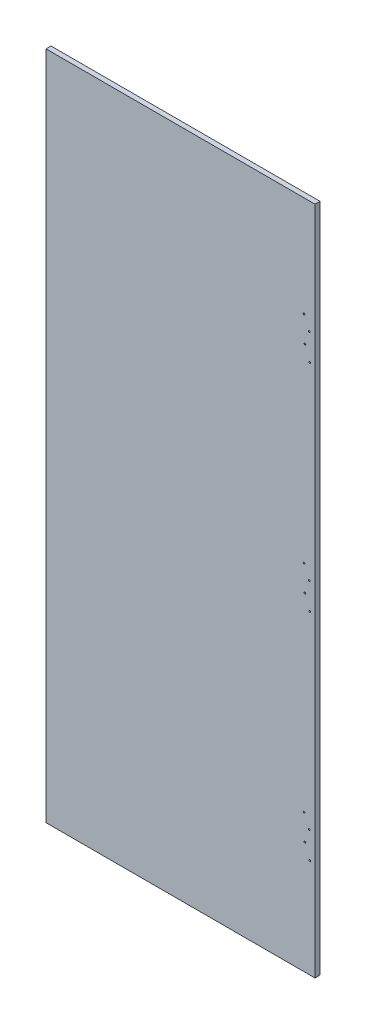
ISO-10303-21;
HEADER;
FILE_DESCRIPTION(('STEP AP214'),'2;1');
FILE_NAME('part.step','',(''),(''),'','','');
FILE_SCHEMA(('AUTOMOTIVE_DESIGN { 1 0 10303 214 1 1 1 1 }'));
ENDSEC;
DATA;
#1=APPLICATION_CONTEXT('core data for automotive mechanical design processes');
#2=APPLICATION_PROTOCOL_DEFINITION('international standard','automotive_design',2000,#1);
#3=PRODUCT_CONTEXT('',#1,'mechanical');
#4=PRODUCT('Part','Part','',(#3));
#5=PRODUCT_RELATED_PRODUCT_CATEGORY('part','',(#4));
#6=PRODUCT_DEFINITION_FORMATION('','',#4);
#7=PRODUCT_DEFINITION_CONTEXT('part definition',#1,'design');
#8=PRODUCT_DEFINITION('design','',#6,#7);
#9=PRODUCT_DEFINITION_SHAPE('','',#8);
#10=(LENGTH_UNIT() NAMED_UNIT(*) SI_UNIT(.MILLI.,.METRE.));
#11=(NAMED_UNIT(*) PLANE_ANGLE_UNIT() SI_UNIT($,.RADIAN.));
#12=(NAMED_UNIT(*) SI_UNIT($,.STERADIAN.) SOLID_ANGLE_UNIT());
#13=UNCERTAINTY_MEASURE_WITH_UNIT(LENGTH_MEASURE(1.E-05),#10,'distance_accuracy_value','');
#14=(GEOMETRIC_REPRESENTATION_CONTEXT(3) GLOBAL_UNCERTAINTY_ASSIGNED_CONTEXT((#13)) GLOBAL_UNIT_ASSIGNED_CONTEXT((#10,
#11,#12)) REPRESENTATION_CONTEXT('',''));
#15=CARTESIAN_POINT('',(0.,0.,0.));
#16=DIRECTION('',(0.,0.,1.));
#17=DIRECTION('',(1.,0.,0.));
#18=AXIS2_PLACEMENT_3D('',#15,#16,#17);
#19=CARTESIAN_POINT('',(111.476778690033,291.039647903282,-15.));
#20=DIRECTION('',(1.,0.,0.));
#21=DIRECTION('',(0.,1.,0.));
#22=AXIS2_PLACEMENT_3D('',#19,#20,#21);
#23=PLANE('',#22);
#24=DIRECTION('',(0.,1.,0.));
#25=VECTOR('',#24,1.);
#26=CARTESIAN_POINT('',(111.476778690033,291.039647903282,0.));
#27=LINE('',#26,#25);
#28=CARTESIAN_POINT('',(111.476778690033,-1728.77325270254,0.));
#29=VERTEX_POINT('',#28);
#30=CARTESIAN_POINT('',(111.476778690033,291.039647903282,0.));
#31=VERTEX_POINT('',#30);
#32=EDGE_CURVE('E101',#29,#31,#27,.T.);
#33=ORIENTED_EDGE('',*,*,#32,.F.);
#34=DIRECTION('',(0.,0.,1.));
#35=VECTOR('',#34,1.);
#36=CARTESIAN_POINT('',(111.476778690033,-1728.77325270254,-15.));
#37=LINE('',#36,#35);
#38=CARTESIAN_POINT('',(111.476778690033,-1728.77325270254,-15.));
#39=VERTEX_POINT('',#38);
#40=EDGE_CURVE('E11',#39,#29,#37,.T.);
#41=ORIENTED_EDGE('',*,*,#40,.F.);
#42=DIRECTION('',(0.,1.,0.));
#43=VECTOR('',#42,1.);
#44=CARTESIAN_POINT('',(111.476778690033,291.039647903282,-15.));
#45=LINE('',#44,#43);
#46=CARTESIAN_POINT('',(111.476778690033,291.039647903282,-15.));
#47=VERTEX_POINT('',#46);
#48=EDGE_CURVE('E94',#39,#47,#45,.T.);
#49=ORIENTED_EDGE('',*,*,#48,.T.);
#50=DIRECTION('',(0.,0.,1.));
#51=VECTOR('',#50,1.);
#52=CARTESIAN_POINT('',(111.476778690033,291.039647903282,-15.));
#53=LINE('',#52,#51);
#54=EDGE_CURVE('E39',#47,#31,#53,.T.);
#55=ORIENTED_EDGE('',*,*,#54,.T.);
#56=EDGE_LOOP('',(#33,#41,#49,#55));
#57=FACE_BOUND('',#56,.T.);
#58=ADVANCED_FACE('F36',(#57),#23,.T.);
#59=CARTESIAN_POINT('',(111.476778690033,-1728.77325270254,-15.));
#60=DIRECTION('',(0.,-1.,0.));
#61=DIRECTION('',(0.,0.,-1.));
#62=AXIS2_PLACEMENT_3D('',#59,#60,#61);
#63=PLANE('',#62);
#64=DIRECTION('',(1.,0.,0.));
#65=VECTOR('',#64,1.);
#66=CARTESIAN_POINT('',(111.476778690033,-1728.77325270254,0.));
#67=LINE('',#66,#65);
#68=CARTESIAN_POINT('',(-699.083744936651,-1728.77325270254,0.));
#69=VERTEX_POINT('',#68);
#70=EDGE_CURVE('E96',#69,#29,#67,.T.);
#71=ORIENTED_EDGE('',*,*,#70,.F.);
#72=DIRECTION('',(0.,0.,1.));
#73=VECTOR('',#72,1.);
#74=CARTESIAN_POINT('',(-699.083744936651,-1728.77325270254,-15.));
#75=LINE('',#74,#73);
#76=CARTESIAN_POINT('',(-699.083744936651,-1728.77325270254,-15.));
#77=VERTEX_POINT('',#76);
#78=EDGE_CURVE('E45',#77,#69,#75,.T.);
#79=ORIENTED_EDGE('',*,*,#78,.F.);
#80=DIRECTION('',(1.,0.,0.));
#81=VECTOR('',#80,1.);
#82=CARTESIAN_POINT('',(111.476778690033,-1728.77325270254,-15.));
#83=LINE('',#82,#81);
#84=EDGE_CURVE('E91',#77,#39,#83,.T.);
#85=ORIENTED_EDGE('',*,*,#84,.T.);
#86=ORIENTED_EDGE('',*,*,#40,.T.);
#87=EDGE_LOOP('',(#71,#79,#85,#86));
#88=FACE_BOUND('',#87,.T.);
#89=ADVANCED_FACE('F112',(#88),#63,.T.);
#90=CARTESIAN_POINT('',(-699.083744936651,291.039647903282,-15.));
#91=DIRECTION('',(-1.,0.,0.));
#92=DIRECTION('',(0.,0.,1.));
#93=AXIS2_PLACEMENT_3D('',#90,#91,#92);
#94=PLANE('',#93);
#95=DIRECTION('',(0.,-1.,0.));
#96=VECTOR('',#95,1.);
#97=CARTESIAN_POINT('',(-699.083744936651,291.039647903282,0.));
#98=LINE('',#97,#96);
#99=CARTESIAN_POINT('',(-699.083744936651,291.039647903282,0.));
#100=VERTEX_POINT('',#99);
#101=EDGE_CURVE('E86',#100,#69,#98,.T.);
#102=ORIENTED_EDGE('',*,*,#101,.F.);
#103=DIRECTION('',(0.,0.,1.));
#104=VECTOR('',#103,1.);
#105=CARTESIAN_POINT('',(-699.083744936651,291.039647903282,-15.));
#106=LINE('',#105,#104);
#107=CARTESIAN_POINT('',(-699.083744936651,291.039647903282,-15.));
#108=VERTEX_POINT('',#107);
#109=EDGE_CURVE('E81',#108,#100,#106,.T.);
#110=ORIENTED_EDGE('',*,*,#109,.F.);
#111=DIRECTION('',(0.,-1.,0.));
#112=VECTOR('',#111,1.);
#113=CARTESIAN_POINT('',(-699.083744936651,291.039647903282,-15.));
#114=LINE('',#113,#112);
#115=EDGE_CURVE('E84',#108,#77,#114,.T.);
#116=ORIENTED_EDGE('',*,*,#115,.T.);
#117=ORIENTED_EDGE('',*,*,#78,.T.);
#118=EDGE_LOOP('',(#102,#110,#116,#117));
#119=FACE_BOUND('',#118,.T.);
#120=ADVANCED_FACE('F83',(#119),#94,.T.);
#121=CARTESIAN_POINT('',(111.476778690033,291.039647903282,-15.));
#122=DIRECTION('',(0.,1.,0.));
#123=DIRECTION('',(-1.,0.,0.));
#124=AXIS2_PLACEMENT_3D('',#121,#122,#123);
#125=PLANE('',#124);
#126=DIRECTION('',(-1.,0.,0.));
#127=VECTOR('',#126,1.);
#128=CARTESIAN_POINT('',(111.476778690033,291.039647903282,0.));
#129=LINE('',#128,#127);
#130=EDGE_CURVE('E104',#31,#100,#129,.T.);
#131=ORIENTED_EDGE('',*,*,#130,.F.);
#132=ORIENTED_EDGE('',*,*,#54,.F.);
#133=DIRECTION('',(-1.,0.,0.));
#134=VECTOR('',#133,1.);
#135=CARTESIAN_POINT('',(111.476778690033,291.039647903282,-15.));
#136=LINE('',#135,#134);
#137=EDGE_CURVE('E90',#47,#108,#136,.T.);
#138=ORIENTED_EDGE('',*,*,#137,.T.);
#139=ORIENTED_EDGE('',*,*,#109,.T.);
#140=EDGE_LOOP('',(#131,#132,#138,#139));
#141=FACE_BOUND('',#140,.T.);
#142=ADVANCED_FACE('F93',(#141),#125,.T.);
#143=CARTESIAN_POINT('',(0.,0.,-15.));
#144=DIRECTION('',(0.,0.,-1.));
#145=DIRECTION('',(-1.,0.,0.));
#146=AXIS2_PLACEMENT_3D('',#143,#144,#145);
#147=PLANE('',#146);
#148=CARTESIAN_POINT('',(78.5158759424546,-12.2840764917066,-15.));
#149=DIRECTION('',(0.,0.,1.));
#150=DIRECTION('',(1.,0.,0.));
#151=AXIS2_PLACEMENT_3D('',#148,#149,#150);
#152=CIRCLE('',#151,2.6406386398121);
#153=CARTESIAN_POINT('',(81.1565145822667,-12.2840764917066,-15.));
#154=VERTEX_POINT('',#153);
#155=EDGE_CURVE('E105',#154,#154,#152,.T.);
#156=ORIENTED_EDGE('',*,*,#155,.T.);
#157=EDGE_LOOP('',(#156));
#158=FACE_BOUND('',#157,.T.);
#159=CARTESIAN_POINT('',(94.1631537007583,-49.8170727082532,-15.));
#160=DIRECTION('',(0.,0.,1.));
#161=DIRECTION('',(1.,0.,0.));
#162=AXIS2_PLACEMENT_3D('',#159,#160,#161);
#163=CIRCLE('',#162,2.50520693818279);
#164=CARTESIAN_POINT('',(96.6683606389411,-49.8170727082532,-15.));
#165=VERTEX_POINT('',#164);
#166=EDGE_CURVE('E188',#165,#165,#163,.T.);
#167=ORIENTED_EDGE('',*,*,#166,.T.);
#168=EDGE_LOOP('',(#167));
#169=FACE_BOUND('',#168,.T.);
#170=CARTESIAN_POINT('',(81.1982664153066,-89.2847594514257,-15.));
#171=DIRECTION('',(0.,0.,1.));
#172=DIRECTION('',(1.,0.,0.));
#173=AXIS2_PLACEMENT_3D('',#170,#171,#172);
#174=CIRCLE('',#173,2.55269895239916);
#175=CARTESIAN_POINT('',(83.7509653677058,-89.2847594514257,-15.));
#176=VERTEX_POINT('',#175);
#177=EDGE_CURVE('E197',#176,#176,#174,.T.);
#178=ORIENTED_EDGE('',*,*,#177,.T.);
#179=EDGE_LOOP('',(#178));
#180=FACE_BOUND('',#179,.T.);
#181=CARTESIAN_POINT('',(95.951414015993,-130.300198615899,-15.));
#182=DIRECTION('',(0.,0.,1.));
#183=DIRECTION('',(1.,0.,0.));
#184=AXIS2_PLACEMENT_3D('',#181,#182,#183);
#185=CIRCLE('',#184,2.552695734833);
#186=CARTESIAN_POINT('',(98.504109750826,-130.300198615899,-15.));
#187=VERTEX_POINT('',#186);
#188=EDGE_CURVE('E203',#187,#187,#185,.T.);
#189=ORIENTED_EDGE('',*,*,#188,.T.);
#190=EDGE_LOOP('',(#189));
#191=FACE_BOUND('',#190,.T.);
#192=CARTESIAN_POINT('',(78.5158759424546,-662.284076491707,-15.));
#193=DIRECTION('',(0.,0.,1.));
#194=DIRECTION('',(1.,0.,0.));
#195=AXIS2_PLACEMENT_3D('',#192,#193,#194);
#196=CIRCLE('',#195,2.5526989933296);
#197=CARTESIAN_POINT('',(81.0685749357842,-662.284076491707,-15.));
#198=VERTEX_POINT('',#197);
#199=EDGE_CURVE('E209',#198,#198,#196,.T.);
#200=ORIENTED_EDGE('',*,*,#199,.T.);
#201=EDGE_LOOP('',(#200));
#202=FACE_BOUND('',#201,.T.);
#203=CARTESIAN_POINT('',(94.1631537007583,-699.817072708253,-15.));
#204=DIRECTION('',(0.,0.,1.));
#205=DIRECTION('',(1.,0.,0.));
#206=AXIS2_PLACEMENT_3D('',#203,#204,#205);
#207=CIRCLE('',#206,2.55269999999998);
#208=CARTESIAN_POINT('',(96.7158537007583,-699.817072708253,-15.));
#209=VERTEX_POINT('',#208);
#210=EDGE_CURVE('E215',#209,#209,#207,.T.);
#211=ORIENTED_EDGE('',*,*,#210,.T.);
#212=EDGE_LOOP('',(#211));
#213=FACE_BOUND('',#212,.T.);
#214=CARTESIAN_POINT('',(81.1982664153066,-739.284759451426,-15.));
#215=DIRECTION('',(0.,0.,1.));
#216=DIRECTION('',(1.,0.,0.));
#217=AXIS2_PLACEMENT_3D('',#214,#215,#216);
#218=CIRCLE('',#217,2.55258606888236);
#219=CARTESIAN_POINT('',(83.750852484189,-739.284759451426,-15.));
#220=VERTEX_POINT('',#219);
#221=EDGE_CURVE('E221',#220,#220,#218,.T.);
#222=ORIENTED_EDGE('',*,*,#221,.T.);
#223=EDGE_LOOP('',(#222));
#224=FACE_BOUND('',#223,.T.);
#225=CARTESIAN_POINT('',(95.951414015993,-780.300198615899,-15.));
#226=DIRECTION('',(0.,0.,1.));
#227=DIRECTION('',(1.,0.,0.));
#228=AXIS2_PLACEMENT_3D('',#225,#226,#227);
#229=CIRCLE('',#228,2.55258606888223);
#230=CARTESIAN_POINT('',(98.5040000848753,-780.300198615899,-15.));
#231=VERTEX_POINT('',#230);
#232=EDGE_CURVE('E227',#231,#231,#229,.T.);
#233=ORIENTED_EDGE('',*,*,#232,.T.);
#234=EDGE_LOOP('',(#233));
#235=FACE_BOUND('',#234,.T.);
#236=CARTESIAN_POINT('',(78.5158759424546,-1312.28407649171,-15.));
#237=DIRECTION('',(0.,0.,1.));
#238=DIRECTION('',(1.,0.,0.));
#239=AXIS2_PLACEMENT_3D('',#236,#237,#238);
#240=CIRCLE('',#239,2.55269191321423);
#241=CARTESIAN_POINT('',(81.0685678556688,-1312.28407649171,-15.));
#242=VERTEX_POINT('',#241);
#243=EDGE_CURVE('E233',#242,#242,#240,.T.);
#244=ORIENTED_EDGE('',*,*,#243,.T.);
#245=EDGE_LOOP('',(#244));
#246=FACE_BOUND('',#245,.T.);
#247=CARTESIAN_POINT('',(94.1631537007583,-1349.81707270825,-15.));
#248=DIRECTION('',(0.,0.,1.));
#249=DIRECTION('',(1.,0.,0.));
#250=AXIS2_PLACEMENT_3D('',#247,#248,#249);
#251=CIRCLE('',#250,2.55258606888224);
#252=CARTESIAN_POINT('',(96.7157397696405,-1349.81707270825,-15.));
#253=VERTEX_POINT('',#252);
#254=EDGE_CURVE('E239',#253,#253,#251,.T.);
#255=ORIENTED_EDGE('',*,*,#254,.T.);
#256=EDGE_LOOP('',(#255));
#257=FACE_BOUND('',#256,.T.);
#258=CARTESIAN_POINT('',(81.1982664153066,-1389.28475945143,-15.));
#259=DIRECTION('',(0.,0.,1.));
#260=DIRECTION('',(1.,0.,0.));
#261=AXIS2_PLACEMENT_3D('',#258,#259,#260);
#262=CIRCLE('',#261,2.55270000000007);
#263=CARTESIAN_POINT('',(83.7509664153067,-1389.28475945143,-15.));
#264=VERTEX_POINT('',#263);
#265=EDGE_CURVE('E245',#264,#264,#262,.T.);
#266=ORIENTED_EDGE('',*,*,#265,.T.);
#267=EDGE_LOOP('',(#266));
#268=FACE_BOUND('',#267,.T.);
#269=CARTESIAN_POINT('',(95.951414015993,-1430.3001986159,-15.));
#270=DIRECTION('',(0.,0.,1.));
#271=DIRECTION('',(1.,0.,0.));
#272=AXIS2_PLACEMENT_3D('',#269,#270,#271);
#273=CIRCLE('',#272,2.55270000000007);
#274=CARTESIAN_POINT('',(98.5041140159931,-1430.3001986159,-15.));
#275=VERTEX_POINT('',#274);
#276=EDGE_CURVE('E251',#275,#275,#273,.T.);
#277=ORIENTED_EDGE('',*,*,#276,.T.);
#278=EDGE_LOOP('',(#277));
#279=FACE_BOUND('',#278,.T.);
#280=ORIENTED_EDGE('',*,*,#48,.F.);
#281=ORIENTED_EDGE('',*,*,#84,.F.);
#282=ORIENTED_EDGE('',*,*,#115,.F.);
#283=ORIENTED_EDGE('',*,*,#137,.F.);
#284=EDGE_LOOP('',(#280,#281,#282,#283));
#285=FACE_BOUND('',#284,.T.);
#286=ADVANCED_FACE('F89',(#158,#169,#180,#191,#202,#213,#224,#235,#246,#257,#268,#279,#285),
#147,.T.);
#287=CARTESIAN_POINT('',(0.,0.,0.));
#288=DIRECTION('',(0.,0.,-1.));
#289=DIRECTION('',(-1.,0.,0.));
#290=AXIS2_PLACEMENT_3D('',#287,#288,#289);
#291=PLANE('',#290);
#292=CARTESIAN_POINT('',(78.5158759424546,-12.2840764917066,0.));
#293=DIRECTION('',(0.,0.,1.));
#294=DIRECTION('',(1.,0.,0.));
#295=AXIS2_PLACEMENT_3D('',#292,#293,#294);
#296=CIRCLE('',#295,2.6406386398121);
#297=CARTESIAN_POINT('',(81.1565145822667,-12.2840764917066,0.));
#298=VERTEX_POINT('',#297);
#299=EDGE_CURVE('E187',#298,#298,#296,.T.);
#300=ORIENTED_EDGE('',*,*,#299,.F.);
#301=EDGE_LOOP('',(#300));
#302=FACE_BOUND('',#301,.T.);
#303=CARTESIAN_POINT('',(94.1631537007583,-49.8170727082532,0.));
#304=DIRECTION('',(0.,0.,1.));
#305=DIRECTION('',(1.,0.,0.));
#306=AXIS2_PLACEMENT_3D('',#303,#304,#305);
#307=CIRCLE('',#306,2.50520693818279);
#308=CARTESIAN_POINT('',(96.6683606389411,-49.8170727082532,0.));
#309=VERTEX_POINT('',#308);
#310=EDGE_CURVE('E192',#309,#309,#307,.T.);
#311=ORIENTED_EDGE('',*,*,#310,.F.);
#312=EDGE_LOOP('',(#311));
#313=FACE_BOUND('',#312,.T.);
#314=CARTESIAN_POINT('',(81.1982664153066,-89.2847594514257,0.));
#315=DIRECTION('',(0.,0.,1.));
#316=DIRECTION('',(1.,0.,0.));
#317=AXIS2_PLACEMENT_3D('',#314,#315,#316);
#318=CIRCLE('',#317,2.55269895239916);
#319=CARTESIAN_POINT('',(83.7509653677058,-89.2847594514257,0.));
#320=VERTEX_POINT('',#319);
#321=EDGE_CURVE('E200',#320,#320,#318,.T.);
#322=ORIENTED_EDGE('',*,*,#321,.F.);
#323=EDGE_LOOP('',(#322));
#324=FACE_BOUND('',#323,.T.);
#325=CARTESIAN_POINT('',(95.951414015993,-130.300198615899,0.));
#326=DIRECTION('',(0.,0.,1.));
#327=DIRECTION('',(1.,0.,0.));
#328=AXIS2_PLACEMENT_3D('',#325,#326,#327);
#329=CIRCLE('',#328,2.552695734833);
#330=CARTESIAN_POINT('',(98.504109750826,-130.300198615899,0.));
#331=VERTEX_POINT('',#330);
#332=EDGE_CURVE('E206',#331,#331,#329,.T.);
#333=ORIENTED_EDGE('',*,*,#332,.F.);
#334=EDGE_LOOP('',(#333));
#335=FACE_BOUND('',#334,.T.);
#336=CARTESIAN_POINT('',(78.5158759424546,-662.284076491707,0.));
#337=DIRECTION('',(0.,0.,1.));
#338=DIRECTION('',(1.,0.,0.));
#339=AXIS2_PLACEMENT_3D('',#336,#337,#338);
#340=CIRCLE('',#339,2.5526989933296);
#341=CARTESIAN_POINT('',(81.0685749357842,-662.284076491707,0.));
#342=VERTEX_POINT('',#341);
#343=EDGE_CURVE('E212',#342,#342,#340,.T.);
#344=ORIENTED_EDGE('',*,*,#343,.F.);
#345=EDGE_LOOP('',(#344));
#346=FACE_BOUND('',#345,.T.);
#347=CARTESIAN_POINT('',(94.1631537007583,-699.817072708253,0.));
#348=DIRECTION('',(0.,0.,1.));
#349=DIRECTION('',(1.,0.,0.));
#350=AXIS2_PLACEMENT_3D('',#347,#348,#349);
#351=CIRCLE('',#350,2.55269999999998);
#352=CARTESIAN_POINT('',(96.7158537007583,-699.817072708253,0.));
#353=VERTEX_POINT('',#352);
#354=EDGE_CURVE('E218',#353,#353,#351,.T.);
#355=ORIENTED_EDGE('',*,*,#354,.F.);
#356=EDGE_LOOP('',(#355));
#357=FACE_BOUND('',#356,.T.);
#358=CARTESIAN_POINT('',(81.1982664153066,-739.284759451426,0.));
#359=DIRECTION('',(0.,0.,1.));
#360=DIRECTION('',(1.,0.,0.));
#361=AXIS2_PLACEMENT_3D('',#358,#359,#360);
#362=CIRCLE('',#361,2.55258606888236);
#363=CARTESIAN_POINT('',(83.750852484189,-739.284759451426,0.));
#364=VERTEX_POINT('',#363);
#365=EDGE_CURVE('E224',#364,#364,#362,.T.);
#366=ORIENTED_EDGE('',*,*,#365,.F.);
#367=EDGE_LOOP('',(#366));
#368=FACE_BOUND('',#367,.T.);
#369=CARTESIAN_POINT('',(95.951414015993,-780.300198615899,0.));
#370=DIRECTION('',(0.,0.,1.));
#371=DIRECTION('',(1.,0.,0.));
#372=AXIS2_PLACEMENT_3D('',#369,#370,#371);
#373=CIRCLE('',#372,2.55258606888223);
#374=CARTESIAN_POINT('',(98.5040000848753,-780.300198615899,0.));
#375=VERTEX_POINT('',#374);
#376=EDGE_CURVE('E230',#375,#375,#373,.T.);
#377=ORIENTED_EDGE('',*,*,#376,.F.);
#378=EDGE_LOOP('',(#377));
#379=FACE_BOUND('',#378,.T.);
#380=CARTESIAN_POINT('',(78.5158759424546,-1312.28407649171,0.));
#381=DIRECTION('',(0.,0.,1.));
#382=DIRECTION('',(1.,0.,0.));
#383=AXIS2_PLACEMENT_3D('',#380,#381,#382);
#384=CIRCLE('',#383,2.55269191321423);
#385=CARTESIAN_POINT('',(81.0685678556688,-1312.28407649171,0.));
#386=VERTEX_POINT('',#385);
#387=EDGE_CURVE('E236',#386,#386,#384,.T.);
#388=ORIENTED_EDGE('',*,*,#387,.F.);
#389=EDGE_LOOP('',(#388));
#390=FACE_BOUND('',#389,.T.);
#391=CARTESIAN_POINT('',(94.1631537007583,-1349.81707270825,0.));
#392=DIRECTION('',(0.,0.,1.));
#393=DIRECTION('',(1.,0.,0.));
#394=AXIS2_PLACEMENT_3D('',#391,#392,#393);
#395=CIRCLE('',#394,2.55258606888224);
#396=CARTESIAN_POINT('',(96.7157397696405,-1349.81707270825,0.));
#397=VERTEX_POINT('',#396);
#398=EDGE_CURVE('E242',#397,#397,#395,.T.);
#399=ORIENTED_EDGE('',*,*,#398,.F.);
#400=EDGE_LOOP('',(#399));
#401=FACE_BOUND('',#400,.T.);
#402=CARTESIAN_POINT('',(81.1982664153066,-1389.28475945143,0.));
#403=DIRECTION('',(0.,0.,1.));
#404=DIRECTION('',(1.,0.,0.));
#405=AXIS2_PLACEMENT_3D('',#402,#403,#404);
#406=CIRCLE('',#405,2.55270000000007);
#407=CARTESIAN_POINT('',(83.7509664153067,-1389.28475945143,0.));
#408=VERTEX_POINT('',#407);
#409=EDGE_CURVE('E248',#408,#408,#406,.T.);
#410=ORIENTED_EDGE('',*,*,#409,.F.);
#411=EDGE_LOOP('',(#410));
#412=FACE_BOUND('',#411,.T.);
#413=CARTESIAN_POINT('',(95.951414015993,-1430.3001986159,0.));
#414=DIRECTION('',(0.,0.,1.));
#415=DIRECTION('',(1.,0.,0.));
#416=AXIS2_PLACEMENT_3D('',#413,#414,#415);
#417=CIRCLE('',#416,2.55270000000007);
#418=CARTESIAN_POINT('',(98.5041140159931,-1430.3001986159,0.));
#419=VERTEX_POINT('',#418);
#420=EDGE_CURVE('E253',#419,#419,#417,.T.);
#421=ORIENTED_EDGE('',*,*,#420,.F.);
#422=EDGE_LOOP('',(#421));
#423=FACE_BOUND('',#422,.T.);
#424=ORIENTED_EDGE('',*,*,#32,.T.);
#425=ORIENTED_EDGE('',*,*,#130,.T.);
#426=ORIENTED_EDGE('',*,*,#101,.T.);
#427=ORIENTED_EDGE('',*,*,#70,.T.);
#428=EDGE_LOOP('',(#424,#425,#426,#427));
#429=FACE_BOUND('',#428,.T.);
#430=ADVANCED_FACE('F111',(#302,#313,#324,#335,#346,#357,#368,#379,#390,#401,#412,#423,#429),
#291,.F.);
#431=CARTESIAN_POINT('',(95.951414015993,-1430.3001986159,-15.));
#432=DIRECTION('',(0.,0.,1.));
#433=DIRECTION('',(1.,0.,0.));
#434=AXIS2_PLACEMENT_3D('',#431,#432,#433);
#435=CYLINDRICAL_SURFACE('',#434,2.55270000000007);
#436=ORIENTED_EDGE('',*,*,#276,.F.);
#437=EDGE_LOOP('',(#436));
#438=FACE_BOUND('',#437,.T.);
#439=ORIENTED_EDGE('',*,*,#420,.T.);
#440=EDGE_LOOP('',(#439));
#441=FACE_BOUND('',#440,.T.);
#442=ADVANCED_FACE('F130',(#438,#441),#435,.F.);
#443=CARTESIAN_POINT('',(81.1982664153066,-1389.28475945143,-15.));
#444=DIRECTION('',(0.,0.,1.));
#445=DIRECTION('',(1.,0.,0.));
#446=AXIS2_PLACEMENT_3D('',#443,#444,#445);
#447=CYLINDRICAL_SURFACE('',#446,2.55270000000007);
#448=ORIENTED_EDGE('',*,*,#265,.F.);
#449=EDGE_LOOP('',(#448));
#450=FACE_BOUND('',#449,.T.);
#451=ORIENTED_EDGE('',*,*,#409,.T.);
#452=EDGE_LOOP('',(#451));
#453=FACE_BOUND('',#452,.T.);
#454=ADVANCED_FACE('F137',(#450,#453),#447,.F.);
#455=CARTESIAN_POINT('',(94.1631537007583,-1349.81707270825,-15.));
#456=DIRECTION('',(0.,0.,1.));
#457=DIRECTION('',(1.,0.,0.));
#458=AXIS2_PLACEMENT_3D('',#455,#456,#457);
#459=CYLINDRICAL_SURFACE('',#458,2.55258606888224);
#460=ORIENTED_EDGE('',*,*,#254,.F.);
#461=EDGE_LOOP('',(#460));
#462=FACE_BOUND('',#461,.T.);
#463=ORIENTED_EDGE('',*,*,#398,.T.);
#464=EDGE_LOOP('',(#463));
#465=FACE_BOUND('',#464,.T.);
#466=ADVANCED_FACE('F141',(#462,#465),#459,.F.);
#467=CARTESIAN_POINT('',(78.5158759424546,-1312.28407649171,-15.));
#468=DIRECTION('',(0.,0.,1.));
#469=DIRECTION('',(1.,0.,0.));
#470=AXIS2_PLACEMENT_3D('',#467,#468,#469);
#471=CYLINDRICAL_SURFACE('',#470,2.55269191321423);
#472=ORIENTED_EDGE('',*,*,#243,.F.);
#473=EDGE_LOOP('',(#472));
#474=FACE_BOUND('',#473,.T.);
#475=ORIENTED_EDGE('',*,*,#387,.T.);
#476=EDGE_LOOP('',(#475));
#477=FACE_BOUND('',#476,.T.);
#478=ADVANCED_FACE('F145',(#474,#477),#471,.F.);
#479=CARTESIAN_POINT('',(95.951414015993,-780.300198615899,-15.));
#480=DIRECTION('',(0.,0.,1.));
#481=DIRECTION('',(1.,0.,0.));
#482=AXIS2_PLACEMENT_3D('',#479,#480,#481);
#483=CYLINDRICAL_SURFACE('',#482,2.55258606888223);
#484=ORIENTED_EDGE('',*,*,#232,.F.);
#485=EDGE_LOOP('',(#484));
#486=FACE_BOUND('',#485,.T.);
#487=ORIENTED_EDGE('',*,*,#376,.T.);
#488=EDGE_LOOP('',(#487));
#489=FACE_BOUND('',#488,.T.);
#490=ADVANCED_FACE('F149',(#486,#489),#483,.F.);
#491=CARTESIAN_POINT('',(81.1982664153066,-739.284759451426,-15.));
#492=DIRECTION('',(0.,0.,1.));
#493=DIRECTION('',(1.,0.,0.));
#494=AXIS2_PLACEMENT_3D('',#491,#492,#493);
#495=CYLINDRICAL_SURFACE('',#494,2.55258606888236);
#496=ORIENTED_EDGE('',*,*,#221,.F.);
#497=EDGE_LOOP('',(#496));
#498=FACE_BOUND('',#497,.T.);
#499=ORIENTED_EDGE('',*,*,#365,.T.);
#500=EDGE_LOOP('',(#499));
#501=FACE_BOUND('',#500,.T.);
#502=ADVANCED_FACE('F153',(#498,#501),#495,.F.);
#503=CARTESIAN_POINT('',(94.1631537007583,-699.817072708253,-15.));
#504=DIRECTION('',(0.,0.,1.));
#505=DIRECTION('',(1.,0.,0.));
#506=AXIS2_PLACEMENT_3D('',#503,#504,#505);
#507=CYLINDRICAL_SURFACE('',#506,2.55269999999998);
#508=ORIENTED_EDGE('',*,*,#210,.F.);
#509=EDGE_LOOP('',(#508));
#510=FACE_BOUND('',#509,.T.);
#511=ORIENTED_EDGE('',*,*,#354,.T.);
#512=EDGE_LOOP('',(#511));
#513=FACE_BOUND('',#512,.T.);
#514=ADVANCED_FACE('F157',(#510,#513),#507,.F.);
#515=CARTESIAN_POINT('',(78.5158759424546,-662.284076491707,-15.));
#516=DIRECTION('',(0.,0.,1.));
#517=DIRECTION('',(1.,0.,0.));
#518=AXIS2_PLACEMENT_3D('',#515,#516,#517);
#519=CYLINDRICAL_SURFACE('',#518,2.5526989933296);
#520=ORIENTED_EDGE('',*,*,#199,.F.);
#521=EDGE_LOOP('',(#520));
#522=FACE_BOUND('',#521,.T.);
#523=ORIENTED_EDGE('',*,*,#343,.T.);
#524=EDGE_LOOP('',(#523));
#525=FACE_BOUND('',#524,.T.);
#526=ADVANCED_FACE('F161',(#522,#525),#519,.F.);
#527=CARTESIAN_POINT('',(95.951414015993,-130.300198615899,-15.));
#528=DIRECTION('',(0.,0.,1.));
#529=DIRECTION('',(1.,0.,0.));
#530=AXIS2_PLACEMENT_3D('',#527,#528,#529);
#531=CYLINDRICAL_SURFACE('',#530,2.552695734833);
#532=ORIENTED_EDGE('',*,*,#188,.F.);
#533=EDGE_LOOP('',(#532));
#534=FACE_BOUND('',#533,.T.);
#535=ORIENTED_EDGE('',*,*,#332,.T.);
#536=EDGE_LOOP('',(#535));
#537=FACE_BOUND('',#536,.T.);
#538=ADVANCED_FACE('F165',(#534,#537),#531,.F.);
#539=CARTESIAN_POINT('',(81.1982664153066,-89.2847594514257,-15.));
#540=DIRECTION('',(0.,0.,1.));
#541=DIRECTION('',(1.,0.,0.));
#542=AXIS2_PLACEMENT_3D('',#539,#540,#541);
#543=CYLINDRICAL_SURFACE('',#542,2.55269895239916);
#544=ORIENTED_EDGE('',*,*,#177,.F.);
#545=EDGE_LOOP('',(#544));
#546=FACE_BOUND('',#545,.T.);
#547=ORIENTED_EDGE('',*,*,#321,.T.);
#548=EDGE_LOOP('',(#547));
#549=FACE_BOUND('',#548,.T.);
#550=ADVANCED_FACE('F169',(#546,#549),#543,.F.);
#551=CARTESIAN_POINT('',(94.1631537007583,-49.8170727082532,-15.));
#552=DIRECTION('',(0.,0.,1.));
#553=DIRECTION('',(1.,0.,0.));
#554=AXIS2_PLACEMENT_3D('',#551,#552,#553);
#555=CYLINDRICAL_SURFACE('',#554,2.50520693818279);
#556=ORIENTED_EDGE('',*,*,#166,.F.);
#557=EDGE_LOOP('',(#556));
#558=FACE_BOUND('',#557,.T.);
#559=ORIENTED_EDGE('',*,*,#310,.T.);
#560=EDGE_LOOP('',(#559));
#561=FACE_BOUND('',#560,.T.);
#562=ADVANCED_FACE('F173',(#558,#561),#555,.F.);
#563=CARTESIAN_POINT('',(78.5158759424546,-12.2840764917066,-15.));
#564=DIRECTION('',(0.,0.,1.));
#565=DIRECTION('',(1.,0.,0.));
#566=AXIS2_PLACEMENT_3D('',#563,#564,#565);
#567=CYLINDRICAL_SURFACE('',#566,2.6406386398121);
#568=ORIENTED_EDGE('',*,*,#155,.F.);
#569=EDGE_LOOP('',(#568));
#570=FACE_BOUND('',#569,.T.);
#571=ORIENTED_EDGE('',*,*,#299,.T.);
#572=EDGE_LOOP('',(#571));
#573=FACE_BOUND('',#572,.T.);
#574=ADVANCED_FACE('F177',(#570,#573),#567,.F.);
#575=CLOSED_SHELL('',(#58,#89,#120,#142,#286,#430,#442,#454,#466,#478,#490,#502,#514,#526,#538,
#550,#562,#574));
#576=MANIFOLD_SOLID_BREP('B2',#575);
#577=ADVANCED_BREP_SHAPE_REPRESENTATION('',(#18,#576),#14);
#578=SHAPE_DEFINITION_REPRESENTATION(#9,#577);
ENDSEC;
END-ISO-10303-21;
